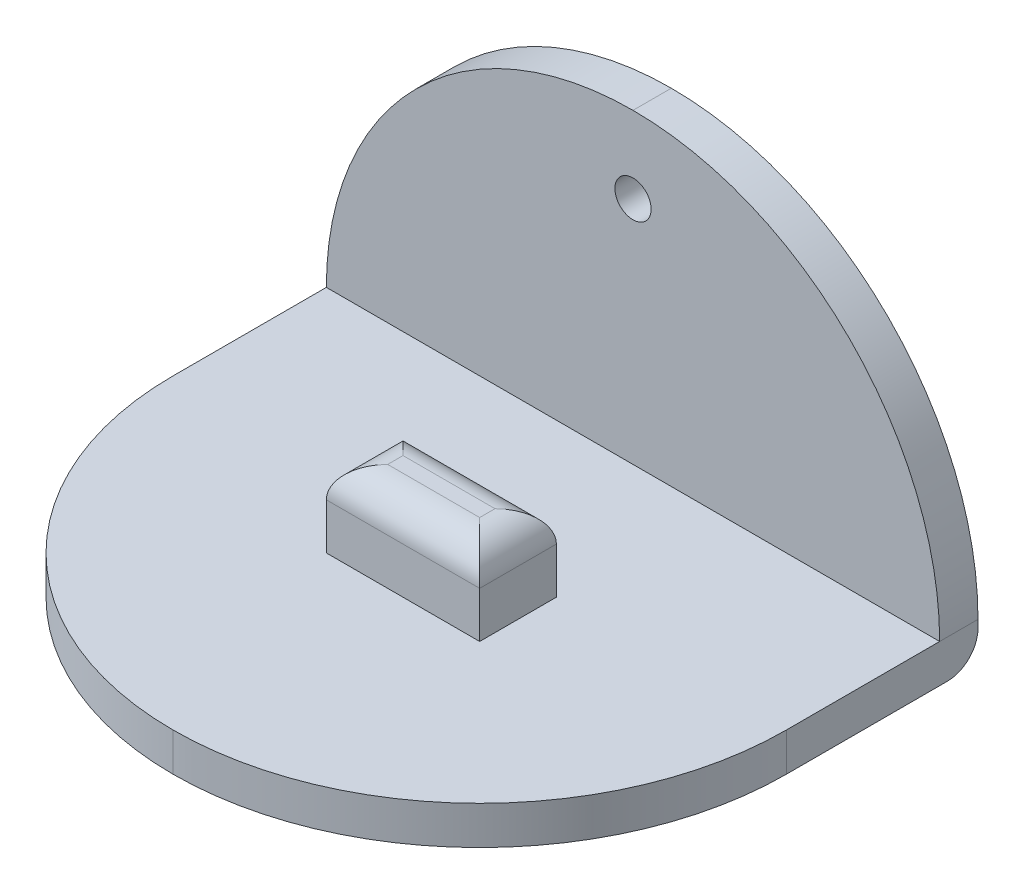
ISO-10303-21;
HEADER;
FILE_DESCRIPTION(('STEP AP214'),'2;1');
FILE_NAME('part.step','',(''),(''),'','','');
FILE_SCHEMA(('AUTOMOTIVE_DESIGN { 1 0 10303 214 1 1 1 1 }'));
ENDSEC;
DATA;
#1=APPLICATION_CONTEXT('core data for automotive mechanical design processes');
#2=APPLICATION_PROTOCOL_DEFINITION('international standard','automotive_design',2000,#1);
#3=PRODUCT_CONTEXT('',#1,'mechanical');
#4=PRODUCT('Part','Part','',(#3));
#5=PRODUCT_RELATED_PRODUCT_CATEGORY('part','',(#4));
#6=PRODUCT_DEFINITION_FORMATION('','',#4);
#7=PRODUCT_DEFINITION_CONTEXT('part definition',#1,'design');
#8=PRODUCT_DEFINITION('design','',#6,#7);
#9=PRODUCT_DEFINITION_SHAPE('','',#8);
#10=(LENGTH_UNIT() NAMED_UNIT(*) SI_UNIT(.MILLI.,.METRE.));
#11=(NAMED_UNIT(*) PLANE_ANGLE_UNIT() SI_UNIT($,.RADIAN.));
#12=(NAMED_UNIT(*) SI_UNIT($,.STERADIAN.) SOLID_ANGLE_UNIT());
#13=UNCERTAINTY_MEASURE_WITH_UNIT(LENGTH_MEASURE(1.E-05),#10,'distance_accuracy_value','');
#14=(GEOMETRIC_REPRESENTATION_CONTEXT(3) GLOBAL_UNCERTAINTY_ASSIGNED_CONTEXT((#13)) GLOBAL_UNIT_ASSIGNED_CONTEXT((#10,
#11,#12)) REPRESENTATION_CONTEXT('',''));
#15=CARTESIAN_POINT('',(0.,0.,0.));
#16=DIRECTION('',(0.,0.,1.));
#17=DIRECTION('',(1.,0.,0.));
#18=AXIS2_PLACEMENT_3D('',#15,#16,#17);
#19=CARTESIAN_POINT('',(50.8,3.175,41.275));
#20=DIRECTION('',(0.,-1.,0.));
#21=DIRECTION('',(0.,0.,-1.));
#22=AXIS2_PLACEMENT_3D('',#19,#20,#21);
#23=PLANE('',#22);
#24=CARTESIAN_POINT('',(25.4,3.175,15.875));
#25=DIRECTION('',(0.,-1.,0.));
#26=DIRECTION('',(0.,0.,-1.));
#27=AXIS2_PLACEMENT_3D('',#24,#25,#26);
#28=CIRCLE('',#27,25.4);
#29=CARTESIAN_POINT('',(0.,3.175,15.875));
#30=VERTEX_POINT('',#29);
#31=CARTESIAN_POINT('',(25.4,3.175,41.275));
#32=VERTEX_POINT('',#31);
#33=EDGE_CURVE('E279',#30,#32,#28,.F.);
#34=ORIENTED_EDGE('',*,*,#33,.T.);
#35=CARTESIAN_POINT('',(25.4,3.175,15.875));
#36=DIRECTION('',(0.,-1.,0.));
#37=DIRECTION('',(0.,0.,-1.));
#38=AXIS2_PLACEMENT_3D('',#35,#36,#37);
#39=CIRCLE('',#38,25.4);
#40=CARTESIAN_POINT('',(50.8,3.175,15.875));
#41=VERTEX_POINT('',#40);
#42=EDGE_CURVE('E282',#32,#41,#39,.F.);
#43=ORIENTED_EDGE('',*,*,#42,.T.);
#44=DIRECTION('',(0.,0.,1.));
#45=VECTOR('',#44,1.);
#46=CARTESIAN_POINT('',(50.8,3.175,41.275));
#47=LINE('',#46,#45);
#48=CARTESIAN_POINT('',(50.8,3.175,3.175));
#49=VERTEX_POINT('',#48);
#50=EDGE_CURVE('E186',#49,#41,#47,.T.);
#51=ORIENTED_EDGE('',*,*,#50,.F.);
#52=DIRECTION('',(-1.,0.,0.));
#53=VECTOR('',#52,1.);
#54=CARTESIAN_POINT('',(50.8,3.175,3.175));
#55=LINE('',#54,#53);
#56=CARTESIAN_POINT('',(0.,3.175,3.175));
#57=VERTEX_POINT('',#56);
#58=EDGE_CURVE('E194',#49,#57,#55,.T.);
#59=ORIENTED_EDGE('',*,*,#58,.T.);
#60=DIRECTION('',(0.,0.,1.));
#61=VECTOR('',#60,1.);
#62=CARTESIAN_POINT('',(0.,3.175,41.275));
#63=LINE('',#62,#61);
#64=EDGE_CURVE('E197',#57,#30,#63,.T.);
#65=ORIENTED_EDGE('',*,*,#64,.T.);
#66=EDGE_LOOP('',(#34,#43,#51,#59,#65));
#67=FACE_BOUND('',#66,.T.);
#68=DIRECTION('',(0.,0.,1.));
#69=VECTOR('',#68,1.);
#70=CARTESIAN_POINT('',(19.05,3.175,22.225));
#71=LINE('',#70,#69);
#72=CARTESIAN_POINT('',(19.05,3.175,15.875));
#73=VERTEX_POINT('',#72);
#74=CARTESIAN_POINT('',(19.05,3.175,22.225));
#75=VERTEX_POINT('',#74);
#76=EDGE_CURVE('E144',#73,#75,#71,.T.);
#77=ORIENTED_EDGE('',*,*,#76,.F.);
#78=DIRECTION('',(-1.,0.,0.));
#79=VECTOR('',#78,1.);
#80=CARTESIAN_POINT('',(19.05,3.175,15.875));
#81=LINE('',#80,#79);
#82=CARTESIAN_POINT('',(31.75,3.175,15.875));
#83=VERTEX_POINT('',#82);
#84=EDGE_CURVE('E153',#83,#73,#81,.T.);
#85=ORIENTED_EDGE('',*,*,#84,.F.);
#86=DIRECTION('',(0.,0.,-1.));
#87=VECTOR('',#86,1.);
#88=CARTESIAN_POINT('',(31.75,3.175,22.225));
#89=LINE('',#88,#87);
#90=CARTESIAN_POINT('',(31.75,3.175,22.225));
#91=VERTEX_POINT('',#90);
#92=EDGE_CURVE('E168',#91,#83,#89,.T.);
#93=ORIENTED_EDGE('',*,*,#92,.F.);
#94=DIRECTION('',(1.,0.,0.));
#95=VECTOR('',#94,1.);
#96=CARTESIAN_POINT('',(19.05,3.175,22.225));
#97=LINE('',#96,#95);
#98=EDGE_CURVE('E161',#75,#91,#97,.T.);
#99=ORIENTED_EDGE('',*,*,#98,.F.);
#100=EDGE_LOOP('',(#77,#85,#93,#99));
#101=FACE_BOUND('',#100,.T.);
#102=ADVANCED_FACE('F38',(#67,#101),#23,.F.);
#103=CARTESIAN_POINT('',(50.8,28.575,0.));
#104=DIRECTION('',(0.,0.,1.));
#105=DIRECTION('',(0.,-1.,0.));
#106=AXIS2_PLACEMENT_3D('',#103,#104,#105);
#107=PLANE('',#106);
#108=CARTESIAN_POINT('',(25.4,22.225,0.));
#109=DIRECTION('',(0.,0.,1.));
#110=DIRECTION('',(1.,0.,0.));
#111=AXIS2_PLACEMENT_3D('',#108,#109,#110);
#112=CIRCLE('',#111,1.499997);
#113=CARTESIAN_POINT('',(26.899997,22.225,0.));
#114=VERTEX_POINT('',#113);
#115=EDGE_CURVE('E163',#114,#114,#112,.T.);
#116=ORIENTED_EDGE('',*,*,#115,.T.);
#117=EDGE_LOOP('',(#116));
#118=FACE_BOUND('',#117,.T.);
#119=DIRECTION('',(0.,1.,0.));
#120=VECTOR('',#119,1.);
#121=CARTESIAN_POINT('',(50.8,28.575,0.));
#122=LINE('',#121,#120);
#123=CARTESIAN_POINT('',(50.8,2.54,0.));
#124=VERTEX_POINT('',#123);
#125=CARTESIAN_POINT('',(50.8,3.17499999999999,0.));
#126=VERTEX_POINT('',#125);
#127=EDGE_CURVE('E183',#124,#126,#122,.T.);
#128=ORIENTED_EDGE('',*,*,#127,.F.);
#129=DIRECTION('',(-1.,0.,0.));
#130=VECTOR('',#129,1.);
#131=CARTESIAN_POINT('',(50.8,2.54,0.));
#132=LINE('',#131,#130);
#133=CARTESIAN_POINT('',(0.,2.54,0.));
#134=VERTEX_POINT('',#133);
#135=EDGE_CURVE('E285',#124,#134,#132,.T.);
#136=ORIENTED_EDGE('',*,*,#135,.T.);
#137=DIRECTION('',(0.,1.,0.));
#138=VECTOR('',#137,1.);
#139=CARTESIAN_POINT('',(0.,28.575,0.));
#140=LINE('',#139,#138);
#141=CARTESIAN_POINT('',(0.,3.17499999999999,0.));
#142=VERTEX_POINT('',#141);
#143=EDGE_CURVE('E182',#134,#142,#140,.T.);
#144=ORIENTED_EDGE('',*,*,#143,.T.);
#145=CARTESIAN_POINT('',(25.4,3.17499999999999,0.));
#146=DIRECTION('',(0.,0.,1.));
#147=DIRECTION('',(0.,-1.,0.));
#148=AXIS2_PLACEMENT_3D('',#145,#146,#147);
#149=CIRCLE('',#148,25.4);
#150=CARTESIAN_POINT('',(25.4,28.575,0.));
#151=VERTEX_POINT('',#150);
#152=EDGE_CURVE('E263',#142,#151,#149,.F.);
#153=ORIENTED_EDGE('',*,*,#152,.T.);
#154=CARTESIAN_POINT('',(25.4,3.17499999999999,0.));
#155=DIRECTION('',(0.,0.,1.));
#156=DIRECTION('',(0.,-1.,0.));
#157=AXIS2_PLACEMENT_3D('',#154,#155,#156);
#158=CIRCLE('',#157,25.4);
#159=EDGE_CURVE('E259',#151,#126,#158,.F.);
#160=ORIENTED_EDGE('',*,*,#159,.T.);
#161=EDGE_LOOP('',(#128,#136,#144,#153,#160));
#162=FACE_BOUND('',#161,.T.);
#163=ADVANCED_FACE('F301',(#118,#162),#107,.F.);
#164=CARTESIAN_POINT('',(50.8,3.175,3.175));
#165=DIRECTION('',(0.,0.,-1.));
#166=DIRECTION('',(0.,1.,0.));
#167=AXIS2_PLACEMENT_3D('',#164,#165,#166);
#168=PLANE('',#167);
#169=CARTESIAN_POINT('',(25.4,22.225,3.175));
#170=DIRECTION('',(0.,0.,1.));
#171=DIRECTION('',(1.,0.,0.));
#172=AXIS2_PLACEMENT_3D('',#169,#170,#171);
#173=CIRCLE('',#172,1.499997);
#174=CARTESIAN_POINT('',(26.899997,22.225,3.175));
#175=VERTEX_POINT('',#174);
#176=EDGE_CURVE('E246',#175,#175,#173,.T.);
#177=ORIENTED_EDGE('',*,*,#176,.F.);
#178=EDGE_LOOP('',(#177));
#179=FACE_BOUND('',#178,.T.);
#180=CARTESIAN_POINT('',(25.4,3.17499999999999,3.175));
#181=DIRECTION('',(0.,0.,-1.));
#182=DIRECTION('',(0.,1.,0.));
#183=AXIS2_PLACEMENT_3D('',#180,#181,#182);
#184=CIRCLE('',#183,25.4);
#185=CARTESIAN_POINT('',(25.4,28.575,3.175));
#186=VERTEX_POINT('',#185);
#187=EDGE_CURVE('E230',#49,#186,#184,.F.);
#188=ORIENTED_EDGE('',*,*,#187,.T.);
#189=CARTESIAN_POINT('',(25.4,3.17499999999999,3.175));
#190=DIRECTION('',(0.,0.,-1.));
#191=DIRECTION('',(0.,1.,0.));
#192=AXIS2_PLACEMENT_3D('',#189,#190,#191);
#193=CIRCLE('',#192,25.4);
#194=EDGE_CURVE('E249',#186,#57,#193,.F.);
#195=ORIENTED_EDGE('',*,*,#194,.T.);
#196=ORIENTED_EDGE('',*,*,#58,.F.);
#197=EDGE_LOOP('',(#188,#195,#196));
#198=FACE_BOUND('',#197,.T.);
#199=ADVANCED_FACE('F323',(#179,#198),#168,.F.);
#200=CARTESIAN_POINT('',(50.8,0.,0.));
#201=DIRECTION('',(0.,1.,0.));
#202=DIRECTION('',(0.,0.,1.));
#203=AXIS2_PLACEMENT_3D('',#200,#201,#202);
#204=PLANE('',#203);
#205=DIRECTION('',(0.,0.,-1.));
#206=VECTOR('',#205,1.);
#207=CARTESIAN_POINT('',(0.,0.,0.));
#208=LINE('',#207,#206);
#209=CARTESIAN_POINT('',(0.,0.,15.875));
#210=VERTEX_POINT('',#209);
#211=CARTESIAN_POINT('',(0.,0.,2.54));
#212=VERTEX_POINT('',#211);
#213=EDGE_CURVE('E187',#210,#212,#208,.T.);
#214=ORIENTED_EDGE('',*,*,#213,.T.);
#215=DIRECTION('',(-1.,0.,0.));
#216=VECTOR('',#215,1.);
#217=CARTESIAN_POINT('',(50.8,0.,2.54));
#218=LINE('',#217,#216);
#219=CARTESIAN_POINT('',(50.8,0.,2.54));
#220=VERTEX_POINT('',#219);
#221=EDGE_CURVE('E47',#212,#220,#218,.F.);
#222=ORIENTED_EDGE('',*,*,#221,.T.);
#223=DIRECTION('',(0.,0.,-1.));
#224=VECTOR('',#223,1.);
#225=CARTESIAN_POINT('',(50.8,0.,0.));
#226=LINE('',#225,#224);
#227=CARTESIAN_POINT('',(50.8,0.,15.875));
#228=VERTEX_POINT('',#227);
#229=EDGE_CURVE('E191',#228,#220,#226,.T.);
#230=ORIENTED_EDGE('',*,*,#229,.F.);
#231=CARTESIAN_POINT('',(25.4,0.,15.875));
#232=DIRECTION('',(0.,1.,0.));
#233=DIRECTION('',(0.,0.,1.));
#234=AXIS2_PLACEMENT_3D('',#231,#232,#233);
#235=CIRCLE('',#234,25.4);
#236=CARTESIAN_POINT('',(25.4,0.,41.275));
#237=VERTEX_POINT('',#236);
#238=EDGE_CURVE('E276',#228,#237,#235,.F.);
#239=ORIENTED_EDGE('',*,*,#238,.T.);
#240=CARTESIAN_POINT('',(25.4,0.,15.875));
#241=DIRECTION('',(0.,1.,0.));
#242=DIRECTION('',(0.,0.,1.));
#243=AXIS2_PLACEMENT_3D('',#240,#241,#242);
#244=CIRCLE('',#243,25.4);
#245=EDGE_CURVE('E273',#237,#210,#244,.F.);
#246=ORIENTED_EDGE('',*,*,#245,.T.);
#247=EDGE_LOOP('',(#214,#222,#230,#239,#246));
#248=FACE_BOUND('',#247,.T.);
#249=ADVANCED_FACE('F330',(#248),#204,.F.);
#250=CARTESIAN_POINT('',(50.8,0.,0.));
#251=DIRECTION('',(-1.,0.,0.));
#252=DIRECTION('',(0.,0.,1.));
#253=AXIS2_PLACEMENT_3D('',#250,#251,#252);
#254=PLANE('',#253);
#255=ORIENTED_EDGE('',*,*,#229,.T.);
#256=CARTESIAN_POINT('',(50.8,2.54,2.54));
#257=DIRECTION('',(-1.,0.,0.));
#258=DIRECTION('',(0.,0.,1.));
#259=AXIS2_PLACEMENT_3D('',#256,#257,#258);
#260=CIRCLE('',#259,2.54);
#261=EDGE_CURVE('E11',#220,#124,#260,.F.);
#262=ORIENTED_EDGE('',*,*,#261,.T.);
#263=ORIENTED_EDGE('',*,*,#127,.T.);
#264=DIRECTION('',(0.,0.,1.));
#265=VECTOR('',#264,1.);
#266=CARTESIAN_POINT('',(50.8,3.17499999999999,0.));
#267=LINE('',#266,#265);
#268=EDGE_CURVE('E270',#126,#49,#267,.T.);
#269=ORIENTED_EDGE('',*,*,#268,.T.);
#270=ORIENTED_EDGE('',*,*,#50,.T.);
#271=DIRECTION('',(0.,-1.,0.));
#272=VECTOR('',#271,1.);
#273=CARTESIAN_POINT('',(50.8,0.,15.875));
#274=LINE('',#273,#272);
#275=EDGE_CURVE('E266',#41,#228,#274,.T.);
#276=ORIENTED_EDGE('',*,*,#275,.T.);
#277=EDGE_LOOP('',(#255,#262,#263,#269,#270,#276));
#278=FACE_BOUND('',#277,.T.);
#279=ADVANCED_FACE('F319',(#278),#254,.F.);
#280=CARTESIAN_POINT('',(0.,0.,0.));
#281=DIRECTION('',(-1.,0.,0.));
#282=DIRECTION('',(0.,0.,1.));
#283=AXIS2_PLACEMENT_3D('',#280,#281,#282);
#284=PLANE('',#283);
#285=ORIENTED_EDGE('',*,*,#143,.F.);
#286=CARTESIAN_POINT('',(0.,2.54,2.54));
#287=DIRECTION('',(-1.,0.,0.));
#288=DIRECTION('',(0.,0.,1.));
#289=AXIS2_PLACEMENT_3D('',#286,#287,#288);
#290=CIRCLE('',#289,2.54);
#291=EDGE_CURVE('E61',#134,#212,#290,.T.);
#292=ORIENTED_EDGE('',*,*,#291,.T.);
#293=ORIENTED_EDGE('',*,*,#213,.F.);
#294=DIRECTION('',(0.,-1.,0.));
#295=VECTOR('',#294,1.);
#296=CARTESIAN_POINT('',(0.,3.175,15.875));
#297=LINE('',#296,#295);
#298=EDGE_CURVE('E252',#210,#30,#297,.F.);
#299=ORIENTED_EDGE('',*,*,#298,.T.);
#300=ORIENTED_EDGE('',*,*,#64,.F.);
#301=DIRECTION('',(0.,0.,1.));
#302=VECTOR('',#301,1.);
#303=CARTESIAN_POINT('',(0.,3.17499999999999,0.));
#304=LINE('',#303,#302);
#305=EDGE_CURVE('E255',#57,#142,#304,.F.);
#306=ORIENTED_EDGE('',*,*,#305,.T.);
#307=EDGE_LOOP('',(#285,#292,#293,#299,#300,#306));
#308=FACE_BOUND('',#307,.T.);
#309=ADVANCED_FACE('F305',(#308),#284,.T.);
#310=CARTESIAN_POINT('',(19.05,9.525,22.225));
#311=DIRECTION('',(1.,0.,0.));
#312=DIRECTION('',(0.,0.,-1.));
#313=AXIS2_PLACEMENT_3D('',#310,#311,#312);
#314=PLANE('',#313);
#315=DIRECTION('',(0.,-1.,0.));
#316=VECTOR('',#315,1.);
#317=CARTESIAN_POINT('',(19.05,9.525,22.225));
#318=LINE('',#317,#316);
#319=CARTESIAN_POINT('',(19.05,6.985,22.225));
#320=VERTEX_POINT('',#319);
#321=EDGE_CURVE('E179',#320,#75,#318,.T.);
#322=ORIENTED_EDGE('',*,*,#321,.F.);
#323=DIRECTION('',(0.,0.,1.));
#324=VECTOR('',#323,1.);
#325=CARTESIAN_POINT('',(19.05,6.985,22.225));
#326=LINE('',#325,#324);
#327=CARTESIAN_POINT('',(19.05,6.985,15.875));
#328=VERTEX_POINT('',#327);
#329=EDGE_CURVE('E146',#320,#328,#326,.F.);
#330=ORIENTED_EDGE('',*,*,#329,.T.);
#331=DIRECTION('',(0.,-1.,0.));
#332=VECTOR('',#331,1.);
#333=CARTESIAN_POINT('',(19.05,9.525,15.875));
#334=LINE('',#333,#332);
#335=EDGE_CURVE('E140',#328,#73,#334,.T.);
#336=ORIENTED_EDGE('',*,*,#335,.T.);
#337=ORIENTED_EDGE('',*,*,#76,.T.);
#338=EDGE_LOOP('',(#322,#330,#336,#337));
#339=FACE_BOUND('',#338,.T.);
#340=ADVANCED_FACE('F143',(#339),#314,.F.);
#341=CARTESIAN_POINT('',(19.05,9.525,22.225));
#342=DIRECTION('',(0.,0.,-1.));
#343=DIRECTION('',(0.,1.,0.));
#344=AXIS2_PLACEMENT_3D('',#341,#342,#343);
#345=PLANE('',#344);
#346=DIRECTION('',(0.,-1.,0.));
#347=VECTOR('',#346,1.);
#348=CARTESIAN_POINT('',(31.75,9.525,22.225));
#349=LINE('',#348,#347);
#350=CARTESIAN_POINT('',(31.75,6.985,22.225));
#351=VERTEX_POINT('',#350);
#352=EDGE_CURVE('E176',#351,#91,#349,.T.);
#353=ORIENTED_EDGE('',*,*,#352,.F.);
#354=DIRECTION('',(1.,0.,0.));
#355=VECTOR('',#354,1.);
#356=CARTESIAN_POINT('',(19.05,6.985,22.225));
#357=LINE('',#356,#355);
#358=EDGE_CURVE('E225',#351,#320,#357,.F.);
#359=ORIENTED_EDGE('',*,*,#358,.T.);
#360=ORIENTED_EDGE('',*,*,#321,.T.);
#361=ORIENTED_EDGE('',*,*,#98,.T.);
#362=EDGE_LOOP('',(#353,#359,#360,#361));
#363=FACE_BOUND('',#362,.T.);
#364=ADVANCED_FACE('F417',(#363),#345,.F.);
#365=CARTESIAN_POINT('',(31.75,9.525,22.225));
#366=DIRECTION('',(-1.,0.,0.));
#367=DIRECTION('',(0.,0.,1.));
#368=AXIS2_PLACEMENT_3D('',#365,#366,#367);
#369=PLANE('',#368);
#370=DIRECTION('',(0.,-1.,0.));
#371=VECTOR('',#370,1.);
#372=CARTESIAN_POINT('',(31.75,9.525,15.875));
#373=LINE('',#372,#371);
#374=CARTESIAN_POINT('',(31.75,6.985,15.875));
#375=VERTEX_POINT('',#374);
#376=EDGE_CURVE('E152',#375,#83,#373,.T.);
#377=ORIENTED_EDGE('',*,*,#376,.F.);
#378=DIRECTION('',(0.,0.,-1.));
#379=VECTOR('',#378,1.);
#380=CARTESIAN_POINT('',(31.75,6.985,22.225));
#381=LINE('',#380,#379);
#382=EDGE_CURVE('E222',#375,#351,#381,.F.);
#383=ORIENTED_EDGE('',*,*,#382,.T.);
#384=ORIENTED_EDGE('',*,*,#352,.T.);
#385=ORIENTED_EDGE('',*,*,#92,.T.);
#386=EDGE_LOOP('',(#377,#383,#384,#385));
#387=FACE_BOUND('',#386,.T.);
#388=ADVANCED_FACE('F425',(#387),#369,.F.);
#389=CARTESIAN_POINT('',(19.05,9.525,15.875));
#390=DIRECTION('',(0.,0.,1.));
#391=DIRECTION('',(0.,-1.,0.));
#392=AXIS2_PLACEMENT_3D('',#389,#390,#391);
#393=PLANE('',#392);
#394=ORIENTED_EDGE('',*,*,#335,.F.);
#395=DIRECTION('',(-1.,0.,0.));
#396=VECTOR('',#395,1.);
#397=CARTESIAN_POINT('',(19.05,6.985,15.875));
#398=LINE('',#397,#396);
#399=EDGE_CURVE('E219',#328,#375,#398,.F.);
#400=ORIENTED_EDGE('',*,*,#399,.T.);
#401=ORIENTED_EDGE('',*,*,#376,.T.);
#402=ORIENTED_EDGE('',*,*,#84,.T.);
#403=EDGE_LOOP('',(#394,#400,#401,#402));
#404=FACE_BOUND('',#403,.T.);
#405=ADVANCED_FACE('F165',(#404),#393,.F.);
#406=CARTESIAN_POINT('',(0.,9.525,0.));
#407=DIRECTION('',(0.,-1.,0.));
#408=DIRECTION('',(0.,0.,-1.));
#409=AXIS2_PLACEMENT_3D('',#406,#407,#408);
#410=PLANE('',#409);
#411=DIRECTION('',(0.,0.,-1.));
#412=VECTOR('',#411,1.);
#413=CARTESIAN_POINT('',(29.21,9.525,0.));
#414=LINE('',#413,#412);
#415=CARTESIAN_POINT('',(29.21,9.525,19.685));
#416=VERTEX_POINT('',#415);
#417=CARTESIAN_POINT('',(29.21,9.525,18.415));
#418=VERTEX_POINT('',#417);
#419=EDGE_CURVE('E212',#416,#418,#414,.T.);
#420=ORIENTED_EDGE('',*,*,#419,.T.);
#421=DIRECTION('',(-1.,0.,0.));
#422=VECTOR('',#421,1.);
#423=CARTESIAN_POINT('',(0.,9.525,18.415));
#424=LINE('',#423,#422);
#425=CARTESIAN_POINT('',(21.59,9.525,18.415));
#426=VERTEX_POINT('',#425);
#427=EDGE_CURVE('E215',#418,#426,#424,.T.);
#428=ORIENTED_EDGE('',*,*,#427,.T.);
#429=DIRECTION('',(0.,0.,1.));
#430=VECTOR('',#429,1.);
#431=CARTESIAN_POINT('',(21.59,9.525,0.));
#432=LINE('',#431,#430);
#433=CARTESIAN_POINT('',(21.59,9.525,19.685));
#434=VERTEX_POINT('',#433);
#435=EDGE_CURVE('E206',#426,#434,#432,.T.);
#436=ORIENTED_EDGE('',*,*,#435,.T.);
#437=DIRECTION('',(1.,0.,0.));
#438=VECTOR('',#437,1.);
#439=CARTESIAN_POINT('',(0.,9.525,19.685));
#440=LINE('',#439,#438);
#441=EDGE_CURVE('E209',#434,#416,#440,.T.);
#442=ORIENTED_EDGE('',*,*,#441,.T.);
#443=EDGE_LOOP('',(#420,#428,#436,#442));
#444=FACE_BOUND('',#443,.T.);
#445=ADVANCED_FACE('F440',(#444),#410,.F.);
#446=CARTESIAN_POINT('',(25.4,22.225,0.));
#447=DIRECTION('',(0.,0.,1.));
#448=DIRECTION('',(1.,0.,0.));
#449=AXIS2_PLACEMENT_3D('',#446,#447,#448);
#450=CYLINDRICAL_SURFACE('',#449,1.499997);
#451=ORIENTED_EDGE('',*,*,#115,.F.);
#452=EDGE_LOOP('',(#451));
#453=FACE_BOUND('',#452,.T.);
#454=ORIENTED_EDGE('',*,*,#176,.T.);
#455=EDGE_LOOP('',(#454));
#456=FACE_BOUND('',#455,.T.);
#457=ADVANCED_FACE('F369',(#453,#456),#450,.F.);
#458=CARTESIAN_POINT('',(0.,6.985,19.685));
#459=DIRECTION('',(1.,0.,0.));
#460=DIRECTION('',(0.,0.,-1.));
#461=AXIS2_PLACEMENT_3D('',#458,#459,#460);
#462=CYLINDRICAL_SURFACE('',#461,2.54);
#463=CARTESIAN_POINT('',(21.59,6.985,19.685));
#464=DIRECTION('',(0.707106781186547,0.,0.707106781186547));
#465=DIRECTION('',(-0.707106781186547,0.,0.707106781186547));
#466=AXIS2_PLACEMENT_3D('',#463,#464,#465);
#467=ELLIPSE('',#466,3.59210244842766,2.54);
#468=EDGE_CURVE('E238',#320,#434,#467,.F.);
#469=ORIENTED_EDGE('',*,*,#468,.F.);
#470=ORIENTED_EDGE('',*,*,#358,.F.);
#471=CARTESIAN_POINT('',(29.21,6.985,19.685));
#472=DIRECTION('',(0.707106781186547,0.,-0.707106781186547));
#473=DIRECTION('',(0.707106781186547,0.,0.707106781186547));
#474=AXIS2_PLACEMENT_3D('',#471,#472,#473);
#475=ELLIPSE('',#474,3.59210244842766,2.54);
#476=EDGE_CURVE('E242',#416,#351,#475,.T.);
#477=ORIENTED_EDGE('',*,*,#476,.F.);
#478=ORIENTED_EDGE('',*,*,#441,.F.);
#479=EDGE_LOOP('',(#469,#470,#477,#478));
#480=FACE_BOUND('',#479,.T.);
#481=ADVANCED_FACE('F365',(#480),#462,.T.);
#482=CARTESIAN_POINT('',(29.21,6.985,0.));
#483=DIRECTION('',(0.,0.,-1.));
#484=DIRECTION('',(-1.,0.,0.));
#485=AXIS2_PLACEMENT_3D('',#482,#483,#484);
#486=CYLINDRICAL_SURFACE('',#485,2.54);
#487=ORIENTED_EDGE('',*,*,#476,.T.);
#488=ORIENTED_EDGE('',*,*,#382,.F.);
#489=CARTESIAN_POINT('',(29.21,6.985,18.415));
#490=DIRECTION('',(-0.707106781186547,0.,-0.707106781186547));
#491=DIRECTION('',(0.707106781186547,0.,-0.707106781186547));
#492=AXIS2_PLACEMENT_3D('',#489,#490,#491);
#493=ELLIPSE('',#492,3.59210244842766,2.54);
#494=EDGE_CURVE('E234',#418,#375,#493,.T.);
#495=ORIENTED_EDGE('',*,*,#494,.F.);
#496=ORIENTED_EDGE('',*,*,#419,.F.);
#497=EDGE_LOOP('',(#487,#488,#495,#496));
#498=FACE_BOUND('',#497,.T.);
#499=ADVANCED_FACE('F361',(#498),#486,.T.);
#500=CARTESIAN_POINT('',(21.59,6.985,0.));
#501=DIRECTION('',(0.,0.,1.));
#502=DIRECTION('',(1.,0.,0.));
#503=AXIS2_PLACEMENT_3D('',#500,#501,#502);
#504=CYLINDRICAL_SURFACE('',#503,2.54);
#505=ORIENTED_EDGE('',*,*,#468,.T.);
#506=ORIENTED_EDGE('',*,*,#435,.F.);
#507=CARTESIAN_POINT('',(21.59,6.985,18.415));
#508=DIRECTION('',(-0.707106781186547,0.,0.707106781186547));
#509=DIRECTION('',(0.707106781186547,0.,0.707106781186547));
#510=AXIS2_PLACEMENT_3D('',#507,#508,#509);
#511=ELLIPSE('',#510,3.59210244842766,2.54);
#512=EDGE_CURVE('E231',#328,#426,#511,.F.);
#513=ORIENTED_EDGE('',*,*,#512,.F.);
#514=ORIENTED_EDGE('',*,*,#329,.F.);
#515=EDGE_LOOP('',(#505,#506,#513,#514));
#516=FACE_BOUND('',#515,.T.);
#517=ADVANCED_FACE('F357',(#516),#504,.T.);
#518=CARTESIAN_POINT('',(0.,6.985,18.415));
#519=DIRECTION('',(-1.,0.,0.));
#520=DIRECTION('',(0.,0.,1.));
#521=AXIS2_PLACEMENT_3D('',#518,#519,#520);
#522=CYLINDRICAL_SURFACE('',#521,2.54);
#523=ORIENTED_EDGE('',*,*,#494,.T.);
#524=ORIENTED_EDGE('',*,*,#399,.F.);
#525=ORIENTED_EDGE('',*,*,#512,.T.);
#526=ORIENTED_EDGE('',*,*,#427,.F.);
#527=EDGE_LOOP('',(#523,#524,#525,#526));
#528=FACE_BOUND('',#527,.T.);
#529=ADVANCED_FACE('F354',(#528),#522,.T.);
#530=CARTESIAN_POINT('',(25.4,3.17499999999999,0.));
#531=DIRECTION('',(0.,0.,1.));
#532=DIRECTION('',(1.,0.,0.));
#533=AXIS2_PLACEMENT_3D('',#530,#531,#532);
#534=CYLINDRICAL_SURFACE('',#533,25.4);
#535=ORIENTED_EDGE('',*,*,#268,.F.);
#536=ORIENTED_EDGE('',*,*,#159,.F.);
#537=DIRECTION('',(0.,0.,1.));
#538=VECTOR('',#537,1.);
#539=CARTESIAN_POINT('',(25.4,28.575,3.175));
#540=LINE('',#539,#538);
#541=EDGE_CURVE('E235',#186,#151,#540,.F.);
#542=ORIENTED_EDGE('',*,*,#541,.F.);
#543=ORIENTED_EDGE('',*,*,#187,.F.);
#544=EDGE_LOOP('',(#535,#536,#542,#543));
#545=FACE_BOUND('',#544,.T.);
#546=ADVANCED_FACE('F315',(#545),#534,.T.);
#547=CARTESIAN_POINT('',(25.4,3.17499999999999,3.175));
#548=DIRECTION('',(0.,0.,-1.));
#549=DIRECTION('',(-1.,0.,0.));
#550=AXIS2_PLACEMENT_3D('',#547,#548,#549);
#551=CYLINDRICAL_SURFACE('',#550,25.4);
#552=ORIENTED_EDGE('',*,*,#152,.F.);
#553=ORIENTED_EDGE('',*,*,#305,.F.);
#554=ORIENTED_EDGE('',*,*,#194,.F.);
#555=ORIENTED_EDGE('',*,*,#541,.T.);
#556=EDGE_LOOP('',(#552,#553,#554,#555));
#557=FACE_BOUND('',#556,.T.);
#558=ADVANCED_FACE('F310',(#557),#551,.T.);
#559=CARTESIAN_POINT('',(25.4,0.,15.875));
#560=DIRECTION('',(0.,1.,0.));
#561=DIRECTION('',(0.,0.,1.));
#562=AXIS2_PLACEMENT_3D('',#559,#560,#561);
#563=CYLINDRICAL_SURFACE('',#562,25.4);
#564=DIRECTION('',(0.,-1.,0.));
#565=VECTOR('',#564,1.);
#566=CARTESIAN_POINT('',(25.4,0.,41.275));
#567=LINE('',#566,#565);
#568=EDGE_CURVE('E289',#32,#237,#567,.T.);
#569=ORIENTED_EDGE('',*,*,#568,.F.);
#570=ORIENTED_EDGE('',*,*,#33,.F.);
#571=ORIENTED_EDGE('',*,*,#298,.F.);
#572=ORIENTED_EDGE('',*,*,#245,.F.);
#573=EDGE_LOOP('',(#569,#570,#571,#572));
#574=FACE_BOUND('',#573,.T.);
#575=ADVANCED_FACE('F334',(#574),#563,.T.);
#576=CARTESIAN_POINT('',(25.4,0.,15.875));
#577=DIRECTION('',(0.,-1.,0.));
#578=DIRECTION('',(0.,0.,-1.));
#579=AXIS2_PLACEMENT_3D('',#576,#577,#578);
#580=CYLINDRICAL_SURFACE('',#579,25.4);
#581=ORIENTED_EDGE('',*,*,#42,.F.);
#582=ORIENTED_EDGE('',*,*,#568,.T.);
#583=ORIENTED_EDGE('',*,*,#238,.F.);
#584=ORIENTED_EDGE('',*,*,#275,.F.);
#585=EDGE_LOOP('',(#581,#582,#583,#584));
#586=FACE_BOUND('',#585,.T.);
#587=ADVANCED_FACE('F329',(#586),#580,.T.);
#588=CARTESIAN_POINT('',(50.8,2.54,2.54));
#589=DIRECTION('',(-1.,0.,0.));
#590=DIRECTION('',(0.,0.,1.));
#591=AXIS2_PLACEMENT_3D('',#588,#589,#590);
#592=CYLINDRICAL_SURFACE('',#591,2.54);
#593=ORIENTED_EDGE('',*,*,#261,.F.);
#594=ORIENTED_EDGE('',*,*,#221,.F.);
#595=ORIENTED_EDGE('',*,*,#291,.F.);
#596=ORIENTED_EDGE('',*,*,#135,.F.);
#597=EDGE_LOOP('',(#593,#594,#595,#596));
#598=FACE_BOUND('',#597,.T.);
#599=ADVANCED_FACE('F40',(#598),#592,.T.);
#600=CLOSED_SHELL('',(#102,#163,#199,#249,#279,#309,#340,#364,#388,#405,#445,#457,#481,#499,
#517,#529,#546,#558,#575,#587,#599));
#601=MANIFOLD_SOLID_BREP('B2',#600);
#602=ADVANCED_BREP_SHAPE_REPRESENTATION('',(#18,#601),#14);
#603=SHAPE_DEFINITION_REPRESENTATION(#9,#602);
ENDSEC;
END-ISO-10303-21;
